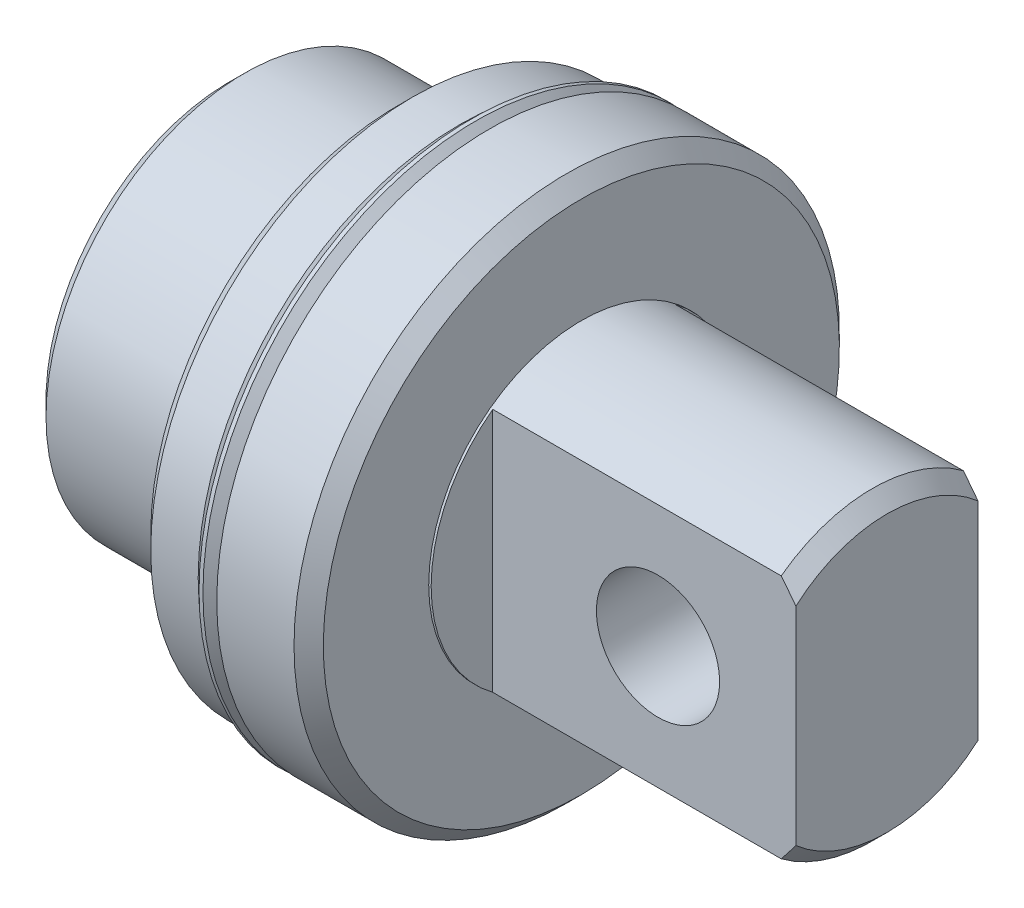
ISO-10303-21;
HEADER;
FILE_DESCRIPTION(('STEP AP214'),'2;1');
FILE_NAME('part.step','',(''),(''),'','','');
FILE_SCHEMA(('AUTOMOTIVE_DESIGN { 1 0 10303 214 1 1 1 1 }'));
ENDSEC;
DATA;
#1=APPLICATION_CONTEXT('core data for automotive mechanical design processes');
#2=APPLICATION_PROTOCOL_DEFINITION('international standard','automotive_design',2000,#1);
#3=PRODUCT_CONTEXT('',#1,'mechanical');
#4=PRODUCT('Part','Part','',(#3));
#5=PRODUCT_RELATED_PRODUCT_CATEGORY('part','',(#4));
#6=PRODUCT_DEFINITION_FORMATION('','',#4);
#7=PRODUCT_DEFINITION_CONTEXT('part definition',#1,'design');
#8=PRODUCT_DEFINITION('design','',#6,#7);
#9=PRODUCT_DEFINITION_SHAPE('','',#8);
#10=(LENGTH_UNIT() NAMED_UNIT(*) SI_UNIT(.MILLI.,.METRE.));
#11=(NAMED_UNIT(*) PLANE_ANGLE_UNIT() SI_UNIT($,.RADIAN.));
#12=(NAMED_UNIT(*) SI_UNIT($,.STERADIAN.) SOLID_ANGLE_UNIT());
#13=UNCERTAINTY_MEASURE_WITH_UNIT(LENGTH_MEASURE(1.E-05),#10,'distance_accuracy_value','');
#14=(GEOMETRIC_REPRESENTATION_CONTEXT(3) GLOBAL_UNCERTAINTY_ASSIGNED_CONTEXT((#13)) GLOBAL_UNIT_ASSIGNED_CONTEXT((#10,
#11,#12)) REPRESENTATION_CONTEXT('',''));
#15=CARTESIAN_POINT('',(0.,0.,0.));
#16=DIRECTION('',(0.,0.,1.));
#17=DIRECTION('',(1.,0.,0.));
#18=AXIS2_PLACEMENT_3D('',#15,#16,#17);
#19=CARTESIAN_POINT('',(25.4,7.16915,0.));
#20=DIRECTION('',(-1.,0.,0.));
#21=DIRECTION('',(0.,0.,1.));
#22=AXIS2_PLACEMENT_3D('',#19,#20,#21);
#23=PLANE('',#22);
#24=DIRECTION('',(0.,1.,0.));
#25=VECTOR('',#24,1.);
#26=CARTESIAN_POINT('',(25.4,-12.68984,-4.73075));
#27=LINE('',#26,#25);
#28=CARTESIAN_POINT('',(25.4,-5.38671664003222,-4.73075));
#29=VERTEX_POINT('',#28);
#30=CARTESIAN_POINT('',(25.4,5.38671664003222,-4.73075));
#31=VERTEX_POINT('',#30);
#32=EDGE_CURVE('E71',#29,#31,#27,.T.);
#33=ORIENTED_EDGE('',*,*,#32,.T.);
#34=CARTESIAN_POINT('',(25.4,0.,0.));
#35=DIRECTION('',(-1.,0.,0.));
#36=DIRECTION('',(0.,0.,1.));
#37=AXIS2_PLACEMENT_3D('',#34,#35,#36);
#38=CIRCLE('',#37,7.16915);
#39=CARTESIAN_POINT('',(25.4,5.38671664003222,4.73075));
#40=VERTEX_POINT('',#39);
#41=EDGE_CURVE('E20',#40,#31,#38,.T.);
#42=ORIENTED_EDGE('',*,*,#41,.F.);
#43=DIRECTION('',(0.,1.,0.));
#44=VECTOR('',#43,1.);
#45=CARTESIAN_POINT('',(25.4,12.68984,4.73075));
#46=LINE('',#45,#44);
#47=CARTESIAN_POINT('',(25.4,-5.38671664003222,4.73075));
#48=VERTEX_POINT('',#47);
#49=EDGE_CURVE('E69',#40,#48,#46,.F.);
#50=ORIENTED_EDGE('',*,*,#49,.T.);
#51=CARTESIAN_POINT('',(25.4,0.,0.));
#52=DIRECTION('',(-1.,0.,0.));
#53=DIRECTION('',(0.,0.,1.));
#54=AXIS2_PLACEMENT_3D('',#51,#52,#53);
#55=CIRCLE('',#54,7.16915);
#56=EDGE_CURVE('E81',#29,#48,#55,.T.);
#57=ORIENTED_EDGE('',*,*,#56,.F.);
#58=EDGE_LOOP('',(#33,#42,#50,#57));
#59=FACE_BOUND('',#58,.T.);
#60=ADVANCED_FACE('F17',(#59),#23,.F.);
#61=CARTESIAN_POINT('',(18.2372,0.,9.4615));
#62=DIRECTION('',(0.,0.,1.));
#63=DIRECTION('',(1.,0.,0.));
#64=AXIS2_PLACEMENT_3D('',#61,#62,#63);
#65=CYLINDRICAL_SURFACE('',#64,3.2004);
#66=CARTESIAN_POINT('',(18.2372,0.,4.73075));
#67=DIRECTION('',(0.,0.,1.));
#68=DIRECTION('',(1.,0.,0.));
#69=AXIS2_PLACEMENT_3D('',#66,#67,#68);
#70=CIRCLE('',#69,3.2004);
#71=CARTESIAN_POINT('',(21.4376,0.,4.73075));
#72=VERTEX_POINT('',#71);
#73=EDGE_CURVE('E95',#72,#72,#70,.T.);
#74=ORIENTED_EDGE('',*,*,#73,.T.);
#75=EDGE_LOOP('',(#74));
#76=FACE_BOUND('',#75,.T.);
#77=CARTESIAN_POINT('',(18.2372,0.,-4.73075));
#78=DIRECTION('',(0.,0.,1.));
#79=DIRECTION('',(1.,0.,0.));
#80=AXIS2_PLACEMENT_3D('',#77,#78,#79);
#81=CIRCLE('',#80,3.2004);
#82=CARTESIAN_POINT('',(21.4376,0.,-4.73075));
#83=VERTEX_POINT('',#82);
#84=EDGE_CURVE('E115',#83,#83,#81,.F.);
#85=ORIENTED_EDGE('',*,*,#84,.T.);
#86=EDGE_LOOP('',(#85));
#87=FACE_BOUND('',#86,.T.);
#88=ADVANCED_FACE('F189',(#76,#87),#65,.F.);
#89=CARTESIAN_POINT('',(24.638,0.,0.));
#90=DIRECTION('',(-1.,0.,0.));
#91=DIRECTION('',(0.,0.,1.));
#92=AXIS2_PLACEMENT_3D('',#89,#90,#91);
#93=CONICAL_SURFACE('',#92,7.93115,0.785398163397447);
#94=CARTESIAN_POINT('',(24.638,0.,0.));
#95=DIRECTION('',(-1.,0.,0.));
#96=DIRECTION('',(0.,0.,1.));
#97=AXIS2_PLACEMENT_3D('',#94,#95,#96);
#98=CIRCLE('',#97,7.93115);
#99=CARTESIAN_POINT('',(24.638,6.36577919503967,4.73075));
#100=VERTEX_POINT('',#99);
#101=CARTESIAN_POINT('',(24.638,6.36577919503967,-4.73075));
#102=VERTEX_POINT('',#101);
#103=EDGE_CURVE('E78',#100,#102,#98,.T.);
#104=ORIENTED_EDGE('',*,*,#103,.F.);
#105=CARTESIAN_POINT('',(24.638,6.36577919503967,4.73075));
#106=CARTESIAN_POINT('',(24.7027180398792,6.28514463726844,4.73075));
#107=CARTESIAN_POINT('',(24.7671723348312,6.20429775471651,4.73075));
#108=CARTESIAN_POINT('',(24.8954904508283,6.0421451960514,4.73075));
#109=CARTESIAN_POINT('',(24.9593543090734,5.96083954936932,4.73075));
#110=CARTESIAN_POINT('',(25.0864373903379,5.79772433204727,4.73075));
#111=CARTESIAN_POINT('',(25.1496566073011,5.71591475668462,4.73075));
#112=CARTESIAN_POINT('',(25.2753820502437,5.55174148093342,4.73075));
#113=CARTESIAN_POINT('',(25.3378882307153,5.46937774570445,4.73075));
#114=CARTESIAN_POINT('',(25.4000000000001,5.38671664003228,4.73075));
#115=B_SPLINE_CURVE_WITH_KNOTS('',3,(#105,#106,#107,#108,#109,#110,#111,#112,#113,#114),
.UNSPECIFIED.,.F.,.F.,(4,2,2,2,4),(0.,0.310182703228819,0.620345728552344,0.930511665064594,
1.24069728762528),.UNSPECIFIED.);
#116=EDGE_CURVE('E75',#100,#40,#115,.T.);
#117=ORIENTED_EDGE('',*,*,#116,.T.);
#118=ORIENTED_EDGE('',*,*,#41,.T.);
#119=CARTESIAN_POINT('',(25.4,5.38671664003222,-4.73075));
#120=CARTESIAN_POINT('',(25.3378882307153,5.46937774570442,-4.73075));
#121=CARTESIAN_POINT('',(25.2753820502437,5.55174148093341,-4.73075));
#122=CARTESIAN_POINT('',(25.1496566073011,5.71591475668462,-4.73075));
#123=CARTESIAN_POINT('',(25.0864373903379,5.79772433204727,-4.73075));
#124=CARTESIAN_POINT('',(24.9593543090734,5.96083954936932,-4.73075));
#125=CARTESIAN_POINT('',(24.8954904508283,6.04214519605139,-4.73075));
#126=CARTESIAN_POINT('',(24.7671723348312,6.20429775471651,-4.73075));
#127=CARTESIAN_POINT('',(24.7027180398792,6.28514463726845,-4.73075));
#128=CARTESIAN_POINT('',(24.638,6.3657791950397,-4.73075));
#129=B_SPLINE_CURVE_WITH_KNOTS('',3,(#119,#120,#121,#122,#123,#124,#125,#126,#127,#128),
.UNSPECIFIED.,.F.,.F.,(4,2,2,2,4),(0.,0.310185622560683,0.620351559072937,0.930514584396463,
1.24069728762528),.UNSPECIFIED.);
#130=EDGE_CURVE('E112',#31,#102,#129,.T.);
#131=ORIENTED_EDGE('',*,*,#130,.T.);
#132=EDGE_LOOP('',(#104,#117,#118,#131));
#133=FACE_BOUND('',#132,.T.);
#134=ADVANCED_FACE('F76',(#133),#93,.T.);
#135=CARTESIAN_POINT('',(9.652,0.,0.));
#136=DIRECTION('',(1.,0.,0.));
#137=DIRECTION('',(0.,0.,-1.));
#138=AXIS2_PLACEMENT_3D('',#135,#136,#137);
#139=PLANE('',#138);
#140=CARTESIAN_POINT('',(9.652,0.,0.));
#141=DIRECTION('',(-1.,0.,0.));
#142=DIRECTION('',(0.,0.,1.));
#143=AXIS2_PLACEMENT_3D('',#140,#141,#142);
#144=CIRCLE('',#143,7.93115);
#145=CARTESIAN_POINT('',(9.652,6.36577919503967,-4.73075));
#146=VERTEX_POINT('',#145);
#147=CARTESIAN_POINT('',(9.652,-6.36577919503967,-4.73075));
#148=VERTEX_POINT('',#147);
#149=EDGE_CURVE('E110',#146,#148,#144,.T.);
#150=ORIENTED_EDGE('',*,*,#149,.F.);
#151=DIRECTION('',(0.,1.,0.));
#152=VECTOR('',#151,1.);
#153=CARTESIAN_POINT('',(9.652,-12.68984,-4.73075));
#154=LINE('',#153,#152);
#155=EDGE_CURVE('E113',#146,#148,#154,.F.);
#156=ORIENTED_EDGE('',*,*,#155,.T.);
#157=EDGE_LOOP('',(#150,#156));
#158=FACE_BOUND('',#157,.T.);
#159=ADVANCED_FACE('F188',(#158),#139,.T.);
#160=CARTESIAN_POINT('',(25.527,-12.68984,-4.73075));
#161=DIRECTION('',(0.,0.,1.));
#162=DIRECTION('',(1.,0.,0.));
#163=AXIS2_PLACEMENT_3D('',#160,#161,#162);
#164=PLANE('',#163);
#165=ORIENTED_EDGE('',*,*,#84,.F.);
#166=EDGE_LOOP('',(#165));
#167=FACE_BOUND('',#166,.T.);
#168=DIRECTION('',(-1.,0.,0.));
#169=VECTOR('',#168,1.);
#170=CARTESIAN_POINT('',(25.4,6.36577919503967,-4.73075));
#171=LINE('',#170,#169);
#172=EDGE_CURVE('E94',#102,#146,#171,.T.);
#173=ORIENTED_EDGE('',*,*,#172,.F.);
#174=ORIENTED_EDGE('',*,*,#130,.F.);
#175=ORIENTED_EDGE('',*,*,#32,.F.);
#176=CARTESIAN_POINT('',(24.638,-6.36577919503967,-4.73075));
#177=CARTESIAN_POINT('',(24.7027180398792,-6.28514463726844,-4.73075));
#178=CARTESIAN_POINT('',(24.7671723348312,-6.20429775471651,-4.73075));
#179=CARTESIAN_POINT('',(24.8954904508283,-6.0421451960514,-4.73075));
#180=CARTESIAN_POINT('',(24.9593543090734,-5.96083954936932,-4.73075));
#181=CARTESIAN_POINT('',(25.0864373903379,-5.79772433204726,-4.73075));
#182=CARTESIAN_POINT('',(25.1496566073011,-5.71591475668462,-4.73075));
#183=CARTESIAN_POINT('',(25.2753820502437,-5.55174148093342,-4.73075));
#184=CARTESIAN_POINT('',(25.3378882307153,-5.46937774570445,-4.73075));
#185=CARTESIAN_POINT('',(25.4000000000001,-5.38671664003228,-4.73075));
#186=B_SPLINE_CURVE_WITH_KNOTS('',3,(#176,#177,#178,#179,#180,#181,#182,#183,#184,#185),
.UNSPECIFIED.,.F.,.F.,(4,2,2,2,4),(0.,0.310182703228819,0.620345728552347,0.930511665064596,
1.24069728762528),.UNSPECIFIED.);
#187=CARTESIAN_POINT('',(24.638,-6.36577919503967,-4.73075));
#188=VERTEX_POINT('',#187);
#189=EDGE_CURVE('E176',#188,#29,#186,.T.);
#190=ORIENTED_EDGE('',*,*,#189,.F.);
#191=DIRECTION('',(-1.,0.,0.));
#192=VECTOR('',#191,1.);
#193=CARTESIAN_POINT('',(25.4,-6.36577919503967,-4.73075000000001));
#194=LINE('',#193,#192);
#195=EDGE_CURVE('E107',#148,#188,#194,.F.);
#196=ORIENTED_EDGE('',*,*,#195,.F.);
#197=ORIENTED_EDGE('',*,*,#155,.F.);
#198=EDGE_LOOP('',(#173,#174,#175,#190,#196,#197));
#199=FACE_BOUND('',#198,.T.);
#200=ADVANCED_FACE('F170',(#167,#199),#164,.F.);
#201=CARTESIAN_POINT('',(24.638,0.,0.));
#202=DIRECTION('',(-1.,0.,0.));
#203=DIRECTION('',(0.,0.,1.));
#204=AXIS2_PLACEMENT_3D('',#201,#202,#203);
#205=CONICAL_SURFACE('',#204,7.93115,0.785398163397447);
#206=ORIENTED_EDGE('',*,*,#56,.T.);
#207=CARTESIAN_POINT('',(25.4,-5.38671664003222,4.73075));
#208=CARTESIAN_POINT('',(25.3378882307153,-5.46937774570442,4.73075));
#209=CARTESIAN_POINT('',(25.2753820502437,-5.55174148093341,4.73075));
#210=CARTESIAN_POINT('',(25.1496566073011,-5.71591475668462,4.73075));
#211=CARTESIAN_POINT('',(25.0864373903379,-5.79772433204727,4.73075));
#212=CARTESIAN_POINT('',(24.9593543090734,-5.96083954936932,4.73075));
#213=CARTESIAN_POINT('',(24.8954904508283,-6.04214519605139,4.73075));
#214=CARTESIAN_POINT('',(24.7671723348312,-6.20429775471651,4.73075));
#215=CARTESIAN_POINT('',(24.7027180398792,-6.28514463726845,4.73075));
#216=CARTESIAN_POINT('',(24.638,-6.3657791950397,4.73075));
#217=B_SPLINE_CURVE_WITH_KNOTS('',3,(#207,#208,#209,#210,#211,#212,#213,#214,#215,#216),
.UNSPECIFIED.,.F.,.F.,(4,2,2,2,4),(0.,0.310185622560682,0.620351559072937,0.930514584396463,
1.24069728762528),.UNSPECIFIED.);
#218=CARTESIAN_POINT('',(24.638,-6.36577919503967,4.73075));
#219=VERTEX_POINT('',#218);
#220=EDGE_CURVE('E86',#48,#219,#217,.T.);
#221=ORIENTED_EDGE('',*,*,#220,.T.);
#222=CARTESIAN_POINT('',(24.638,0.,0.));
#223=DIRECTION('',(-1.,0.,0.));
#224=DIRECTION('',(0.,0.,1.));
#225=AXIS2_PLACEMENT_3D('',#222,#223,#224);
#226=CIRCLE('',#225,7.93115);
#227=EDGE_CURVE('E104',#188,#219,#226,.T.);
#228=ORIENTED_EDGE('',*,*,#227,.F.);
#229=ORIENTED_EDGE('',*,*,#189,.T.);
#230=EDGE_LOOP('',(#206,#221,#228,#229));
#231=FACE_BOUND('',#230,.T.);
#232=ADVANCED_FACE('F165',(#231),#205,.T.);
#233=CARTESIAN_POINT('',(9.652,0.,0.));
#234=DIRECTION('',(1.,0.,0.));
#235=DIRECTION('',(0.,0.,-1.));
#236=AXIS2_PLACEMENT_3D('',#233,#234,#235);
#237=PLANE('',#236);
#238=CARTESIAN_POINT('',(9.652,0.,0.));
#239=DIRECTION('',(-1.,0.,0.));
#240=DIRECTION('',(0.,0.,1.));
#241=AXIS2_PLACEMENT_3D('',#238,#239,#240);
#242=CIRCLE('',#241,7.93115);
#243=CARTESIAN_POINT('',(9.652,-6.36577919503968,4.73075));
#244=VERTEX_POINT('',#243);
#245=CARTESIAN_POINT('',(9.652,6.36577919503967,4.73075));
#246=VERTEX_POINT('',#245);
#247=EDGE_CURVE('E99',#244,#246,#242,.T.);
#248=ORIENTED_EDGE('',*,*,#247,.F.);
#249=DIRECTION('',(0.,1.,0.));
#250=VECTOR('',#249,1.);
#251=CARTESIAN_POINT('',(9.652,12.68984,4.73075));
#252=LINE('',#251,#250);
#253=EDGE_CURVE('E34',#244,#246,#252,.T.);
#254=ORIENTED_EDGE('',*,*,#253,.T.);
#255=EDGE_LOOP('',(#248,#254));
#256=FACE_BOUND('',#255,.T.);
#257=ADVANCED_FACE('F169',(#256),#237,.T.);
#258=CARTESIAN_POINT('',(25.527,12.68984,4.73075));
#259=DIRECTION('',(0.,0.,-1.));
#260=DIRECTION('',(-1.,0.,0.));
#261=AXIS2_PLACEMENT_3D('',#258,#259,#260);
#262=PLANE('',#261);
#263=ORIENTED_EDGE('',*,*,#73,.F.);
#264=EDGE_LOOP('',(#263));
#265=FACE_BOUND('',#264,.T.);
#266=DIRECTION('',(-1.,0.,0.));
#267=VECTOR('',#266,1.);
#268=CARTESIAN_POINT('',(25.4,-6.36577919503967,4.73075));
#269=LINE('',#268,#267);
#270=EDGE_CURVE('E101',#219,#244,#269,.T.);
#271=ORIENTED_EDGE('',*,*,#270,.F.);
#272=ORIENTED_EDGE('',*,*,#220,.F.);
#273=ORIENTED_EDGE('',*,*,#49,.F.);
#274=ORIENTED_EDGE('',*,*,#116,.F.);
#275=DIRECTION('',(-1.,0.,0.));
#276=VECTOR('',#275,1.);
#277=CARTESIAN_POINT('',(25.4,6.36577919503967,4.73075));
#278=LINE('',#277,#276);
#279=EDGE_CURVE('E96',#246,#100,#278,.F.);
#280=ORIENTED_EDGE('',*,*,#279,.F.);
#281=ORIENTED_EDGE('',*,*,#253,.F.);
#282=EDGE_LOOP('',(#271,#272,#273,#274,#280,#281));
#283=FACE_BOUND('',#282,.T.);
#284=ADVANCED_FACE('F85',(#265,#283),#262,.F.);
#285=CARTESIAN_POINT('',(25.4,0.,0.));
#286=DIRECTION('',(-1.,0.,0.));
#287=DIRECTION('',(0.,0.,1.));
#288=AXIS2_PLACEMENT_3D('',#285,#286,#287);
#289=CYLINDRICAL_SURFACE('',#288,7.93115);
#290=CARTESIAN_POINT('',(9.525,0.,0.));
#291=DIRECTION('',(-1.,0.,0.));
#292=DIRECTION('',(0.,0.,1.));
#293=AXIS2_PLACEMENT_3D('',#290,#291,#292);
#294=CIRCLE('',#293,7.93115);
#295=CARTESIAN_POINT('',(9.525,0.,7.93115));
#296=VERTEX_POINT('',#295);
#297=EDGE_CURVE('E98',#296,#296,#294,.F.);
#298=ORIENTED_EDGE('',*,*,#297,.T.);
#299=EDGE_LOOP('',(#298));
#300=FACE_BOUND('',#299,.T.);
#301=ORIENTED_EDGE('',*,*,#247,.T.);
#302=ORIENTED_EDGE('',*,*,#279,.T.);
#303=ORIENTED_EDGE('',*,*,#103,.T.);
#304=ORIENTED_EDGE('',*,*,#172,.T.);
#305=ORIENTED_EDGE('',*,*,#149,.T.);
#306=ORIENTED_EDGE('',*,*,#195,.T.);
#307=ORIENTED_EDGE('',*,*,#227,.T.);
#308=ORIENTED_EDGE('',*,*,#270,.T.);
#309=EDGE_LOOP('',(#301,#302,#303,#304,#305,#306,#307,#308));
#310=FACE_BOUND('',#309,.T.);
#311=ADVANCED_FACE('F272',(#300,#310),#289,.T.);
#312=CARTESIAN_POINT('',(9.525,13.40485,0.));
#313=DIRECTION('',(-1.,0.,0.));
#314=DIRECTION('',(0.,0.,1.));
#315=AXIS2_PLACEMENT_3D('',#312,#313,#314);
#316=PLANE('',#315);
#317=CARTESIAN_POINT('',(9.525,0.,0.));
#318=DIRECTION('',(-1.,0.,0.));
#319=DIRECTION('',(0.,-1.,0.));
#320=AXIS2_PLACEMENT_3D('',#317,#318,#319);
#321=CIRCLE('',#320,13.40485);
#322=CARTESIAN_POINT('',(9.525,-13.40485,0.));
#323=VERTEX_POINT('',#322);
#324=EDGE_CURVE('E142',#323,#323,#321,.T.);
#325=ORIENTED_EDGE('',*,*,#324,.F.);
#326=EDGE_LOOP('',(#325));
#327=FACE_BOUND('',#326,.T.);
#328=ORIENTED_EDGE('',*,*,#297,.F.);
#329=EDGE_LOOP('',(#328));
#330=FACE_BOUND('',#329,.T.);
#331=ADVANCED_FACE('F266',(#327,#330),#316,.F.);
#332=CARTESIAN_POINT('',(8.763,0.,0.));
#333=DIRECTION('',(-1.,0.,0.));
#334=DIRECTION('',(0.,-1.,0.));
#335=AXIS2_PLACEMENT_3D('',#332,#333,#334);
#336=CONICAL_SURFACE('',#335,14.16685,0.785398163397448);
#337=CARTESIAN_POINT('',(8.763,0.,0.));
#338=DIRECTION('',(-1.,0.,0.));
#339=DIRECTION('',(0.,0.,1.));
#340=AXIS2_PLACEMENT_3D('',#337,#338,#339);
#341=CIRCLE('',#340,14.16685);
#342=CARTESIAN_POINT('',(8.763,0.,14.16685));
#343=VERTEX_POINT('',#342);
#344=EDGE_CURVE('E141',#343,#343,#341,.T.);
#345=ORIENTED_EDGE('',*,*,#344,.F.);
#346=EDGE_LOOP('',(#345));
#347=FACE_BOUND('',#346,.T.);
#348=ORIENTED_EDGE('',*,*,#324,.T.);
#349=EDGE_LOOP('',(#348));
#350=FACE_BOUND('',#349,.T.);
#351=ADVANCED_FACE('F263',(#347,#350),#336,.T.);
#352=CARTESIAN_POINT('',(9.525,0.,0.));
#353=DIRECTION('',(-1.,0.,0.));
#354=DIRECTION('',(0.,0.,1.));
#355=AXIS2_PLACEMENT_3D('',#352,#353,#354);
#356=CYLINDRICAL_SURFACE('',#355,14.16685);
#357=CARTESIAN_POINT('',(4.7498,0.,0.));
#358=DIRECTION('',(-1.,0.,0.));
#359=DIRECTION('',(0.,0.,1.));
#360=AXIS2_PLACEMENT_3D('',#357,#358,#359);
#361=CIRCLE('',#360,14.16685);
#362=CARTESIAN_POINT('',(4.7498,0.,14.16685));
#363=VERTEX_POINT('',#362);
#364=EDGE_CURVE('E138',#363,#363,#361,.F.);
#365=ORIENTED_EDGE('',*,*,#364,.T.);
#366=EDGE_LOOP('',(#365));
#367=FACE_BOUND('',#366,.T.);
#368=ORIENTED_EDGE('',*,*,#344,.T.);
#369=EDGE_LOOP('',(#368));
#370=FACE_BOUND('',#369,.T.);
#371=ADVANCED_FACE('F261',(#367,#370),#356,.T.);
#372=CARTESIAN_POINT('',(4.7498,12.84605,0.));
#373=DIRECTION('',(1.,0.,0.));
#374=DIRECTION('',(0.,0.,-1.));
#375=AXIS2_PLACEMENT_3D('',#372,#373,#374);
#376=PLANE('',#375);
#377=CARTESIAN_POINT('',(4.7498,0.,0.));
#378=DIRECTION('',(-1.,0.,0.));
#379=DIRECTION('',(0.,0.,1.));
#380=AXIS2_PLACEMENT_3D('',#377,#378,#379);
#381=CIRCLE('',#380,13.4490489304025);
#382=CARTESIAN_POINT('',(4.7498,0.,13.4490489304025));
#383=VERTEX_POINT('',#382);
#384=EDGE_CURVE('E135',#383,#383,#381,.T.);
#385=ORIENTED_EDGE('',*,*,#384,.F.);
#386=EDGE_LOOP('',(#385));
#387=FACE_BOUND('',#386,.T.);
#388=ORIENTED_EDGE('',*,*,#364,.F.);
#389=EDGE_LOOP('',(#388));
#390=FACE_BOUND('',#389,.T.);
#391=ADVANCED_FACE('F306',(#387,#390),#376,.F.);
#392=CARTESIAN_POINT('',(4.03199893040251,0.,0.));
#393=DIRECTION('',(-1.,0.,0.));
#394=DIRECTION('',(0.,0.,1.));
#395=AXIS2_PLACEMENT_3D('',#392,#393,#394);
#396=CONICAL_SURFACE('',#395,14.16685,0.785398163397456);
#397=ORIENTED_EDGE('',*,*,#384,.T.);
#398=EDGE_LOOP('',(#397));
#399=FACE_BOUND('',#398,.T.);
#400=CARTESIAN_POINT('',(4.03199893040252,0.,0.));
#401=DIRECTION('',(-1.,0.,0.));
#402=DIRECTION('',(0.,0.,1.));
#403=AXIS2_PLACEMENT_3D('',#400,#401,#402);
#404=CIRCLE('',#403,14.16685);
#405=CARTESIAN_POINT('',(4.03199893040252,0.,14.16685));
#406=VERTEX_POINT('',#405);
#407=EDGE_CURVE('E134',#406,#406,#404,.T.);
#408=ORIENTED_EDGE('',*,*,#407,.F.);
#409=EDGE_LOOP('',(#408));
#410=FACE_BOUND('',#409,.T.);
#411=ADVANCED_FACE('F314',(#399,#410),#396,.T.);
#412=CARTESIAN_POINT('',(4.7498,0.,0.));
#413=DIRECTION('',(-1.,0.,0.));
#414=DIRECTION('',(0.,0.,1.));
#415=AXIS2_PLACEMENT_3D('',#412,#413,#414);
#416=CYLINDRICAL_SURFACE('',#415,14.16685);
#417=ORIENTED_EDGE('',*,*,#407,.T.);
#418=EDGE_LOOP('',(#417));
#419=FACE_BOUND('',#418,.T.);
#420=CARTESIAN_POINT('',(3.82879893040252,0.,0.));
#421=DIRECTION('',(-1.,0.,0.));
#422=DIRECTION('',(0.,0.,1.));
#423=AXIS2_PLACEMENT_3D('',#420,#421,#422);
#424=CIRCLE('',#423,14.16685);
#425=CARTESIAN_POINT('',(3.82879893040252,0.,14.16685));
#426=VERTEX_POINT('',#425);
#427=EDGE_CURVE('E131',#426,#426,#424,.T.);
#428=ORIENTED_EDGE('',*,*,#427,.F.);
#429=EDGE_LOOP('',(#428));
#430=FACE_BOUND('',#429,.T.);
#431=ADVANCED_FACE('F322',(#419,#430),#416,.T.);
#432=CARTESIAN_POINT('',(3.82879893040252,14.16685,0.));
#433=DIRECTION('',(-1.,0.,0.));
#434=DIRECTION('',(0.,0.,1.));
#435=AXIS2_PLACEMENT_3D('',#432,#433,#434);
#436=PLANE('',#435);
#437=ORIENTED_EDGE('',*,*,#427,.T.);
#438=EDGE_LOOP('',(#437));
#439=FACE_BOUND('',#438,.T.);
#440=CARTESIAN_POINT('',(3.82879893040252,0.,0.));
#441=DIRECTION('',(-1.,0.,0.));
#442=DIRECTION('',(0.,-1.,0.));
#443=AXIS2_PLACEMENT_3D('',#440,#441,#442);
#444=CIRCLE('',#443,14.0826818041258);
#445=CARTESIAN_POINT('',(3.82879893040252,-14.0826818041258,0.));
#446=VERTEX_POINT('',#445);
#447=EDGE_CURVE('E127',#446,#446,#444,.F.);
#448=ORIENTED_EDGE('',*,*,#447,.T.);
#449=EDGE_LOOP('',(#448));
#450=FACE_BOUND('',#449,.T.);
#451=ADVANCED_FACE('F330',(#439,#450),#436,.T.);
#452=CARTESIAN_POINT('',(3.82879893040252,0.,0.));
#453=DIRECTION('',(-1.,0.,0.));
#454=DIRECTION('',(0.,-1.,0.));
#455=AXIS2_PLACEMENT_3D('',#452,#453,#454);
#456=CONICAL_SURFACE('',#455,14.0826818041258,0.785398163397448);
#457=ORIENTED_EDGE('',*,*,#447,.F.);
#458=EDGE_LOOP('',(#457));
#459=FACE_BOUND('',#458,.T.);
#460=CARTESIAN_POINT('',(4.62731280605345,0.,0.));
#461=DIRECTION('',(1.,0.,0.));
#462=DIRECTION('',(0.,0.,-1.));
#463=AXIS2_PLACEMENT_3D('',#460,#461,#462);
#464=CIRCLE('',#463,13.2841679284748);
#465=CARTESIAN_POINT('',(4.62731280605345,0.,-13.2841679284748));
#466=VERTEX_POINT('',#465);
#467=EDGE_CURVE('E130',#466,#466,#464,.T.);
#468=ORIENTED_EDGE('',*,*,#467,.T.);
#469=EDGE_LOOP('',(#468));
#470=FACE_BOUND('',#469,.T.);
#471=ADVANCED_FACE('F242',(#459,#470),#456,.F.);
#472=CARTESIAN_POINT('',(4.53751024484277,0.,0.));
#473=DIRECTION('',(1.,0.,0.));
#474=DIRECTION('',(0.,0.,-1.));
#475=AXIS2_PLACEMENT_3D('',#472,#473,#474);
#476=TOROIDAL_SURFACE('',#475,13.1943653672641,0.126999999999999);
#477=CARTESIAN_POINT('',(4.62731280605346,0.,0.));
#478=DIRECTION('',(1.,0.,0.));
#479=DIRECTION('',(0.,0.,-1.));
#480=AXIS2_PLACEMENT_3D('',#477,#478,#479);
#481=CIRCLE('',#480,13.1045628060535);
#482=CARTESIAN_POINT('',(4.62731280605346,0.,-13.1045628060535));
#483=VERTEX_POINT('',#482);
#484=EDGE_CURVE('E252',#483,#483,#481,.F.);
#485=ORIENTED_EDGE('',*,*,#484,.F.);
#486=EDGE_LOOP('',(#485));
#487=FACE_BOUND('',#486,.T.);
#488=ORIENTED_EDGE('',*,*,#467,.F.);
#489=EDGE_LOOP('',(#488));
#490=FACE_BOUND('',#489,.T.);
#491=ADVANCED_FACE('F237',(#487,#490),#476,.F.);
#492=CARTESIAN_POINT('',(4.62731280605346,0.,0.));
#493=DIRECTION('',(1.,0.,0.));
#494=DIRECTION('',(0.,0.,-1.));
#495=AXIS2_PLACEMENT_3D('',#492,#493,#494);
#496=CONICAL_SURFACE('',#495,13.1045628060535,0.785398163397452);
#497=ORIENTED_EDGE('',*,*,#484,.T.);
#498=EDGE_LOOP('',(#497));
#499=FACE_BOUND('',#498,.T.);
#500=CARTESIAN_POINT('',(4.3688,0.,0.));
#501=DIRECTION('',(-1.,0.,0.));
#502=DIRECTION('',(0.,0.,1.));
#503=AXIS2_PLACEMENT_3D('',#500,#501,#502);
#504=CIRCLE('',#503,12.84605);
#505=CARTESIAN_POINT('',(4.3688,0.,12.84605));
#506=VERTEX_POINT('',#505);
#507=EDGE_CURVE('E546',#506,#506,#504,.T.);
#508=ORIENTED_EDGE('',*,*,#507,.F.);
#509=EDGE_LOOP('',(#508));
#510=FACE_BOUND('',#509,.T.);
#511=ADVANCED_FACE('F233',(#499,#510),#496,.T.);
#512=CARTESIAN_POINT('',(9.525,0.,0.));
#513=DIRECTION('',(-1.,0.,0.));
#514=DIRECTION('',(0.,0.,1.));
#515=AXIS2_PLACEMENT_3D('',#512,#513,#514);
#516=CYLINDRICAL_SURFACE('',#515,12.84605);
#517=CARTESIAN_POINT('',(3.9878,0.,0.));
#518=DIRECTION('',(-1.,0.,0.));
#519=DIRECTION('',(0.,0.,1.));
#520=AXIS2_PLACEMENT_3D('',#517,#518,#519);
#521=CIRCLE('',#520,12.84605);
#522=CARTESIAN_POINT('',(3.9878,0.,12.84605));
#523=VERTEX_POINT('',#522);
#524=EDGE_CURVE('E549',#523,#523,#521,.T.);
#525=ORIENTED_EDGE('',*,*,#524,.F.);
#526=EDGE_LOOP('',(#525));
#527=FACE_BOUND('',#526,.T.);
#528=ORIENTED_EDGE('',*,*,#507,.T.);
#529=EDGE_LOOP('',(#528));
#530=FACE_BOUND('',#529,.T.);
#531=ADVANCED_FACE('F229',(#527,#530),#516,.T.);
#532=CARTESIAN_POINT('',(3.2258,0.,0.));
#533=DIRECTION('',(-1.,0.,0.));
#534=DIRECTION('',(0.,0.,1.));
#535=AXIS2_PLACEMENT_3D('',#532,#533,#534);
#536=CONICAL_SURFACE('',#535,13.60805,0.785398163397448);
#537=CARTESIAN_POINT('',(3.2258,0.,0.));
#538=DIRECTION('',(-1.,0.,0.));
#539=DIRECTION('',(0.,0.,1.));
#540=AXIS2_PLACEMENT_3D('',#537,#538,#539);
#541=CIRCLE('',#540,13.60805);
#542=CARTESIAN_POINT('',(3.2258,0.,13.60805));
#543=VERTEX_POINT('',#542);
#544=EDGE_CURVE('E558',#543,#543,#541,.T.);
#545=ORIENTED_EDGE('',*,*,#544,.F.);
#546=EDGE_LOOP('',(#545));
#547=FACE_BOUND('',#546,.T.);
#548=ORIENTED_EDGE('',*,*,#524,.T.);
#549=EDGE_LOOP('',(#548));
#550=FACE_BOUND('',#549,.T.);
#551=ADVANCED_FACE('F225',(#547,#550),#536,.T.);
#552=CARTESIAN_POINT('',(9.525,0.,0.));
#553=DIRECTION('',(-1.,0.,0.));
#554=DIRECTION('',(0.,0.,1.));
#555=AXIS2_PLACEMENT_3D('',#552,#553,#554);
#556=CYLINDRICAL_SURFACE('',#555,13.60805);
#557=CARTESIAN_POINT('',(0.762000000000001,0.,0.));
#558=DIRECTION('',(1.,0.,0.));
#559=DIRECTION('',(0.,0.,-1.));
#560=AXIS2_PLACEMENT_3D('',#557,#558,#559);
#561=CIRCLE('',#560,13.60805);
#562=CARTESIAN_POINT('',(0.762,0.,-13.60805));
#563=VERTEX_POINT('',#562);
#564=EDGE_CURVE('E126',#563,#563,#561,.F.);
#565=ORIENTED_EDGE('',*,*,#564,.F.);
#566=EDGE_LOOP('',(#565));
#567=FACE_BOUND('',#566,.T.);
#568=ORIENTED_EDGE('',*,*,#544,.T.);
#569=EDGE_LOOP('',(#568));
#570=FACE_BOUND('',#569,.T.);
#571=ADVANCED_FACE('F221',(#567,#570),#556,.T.);
#572=CARTESIAN_POINT('',(0.762,0.,0.));
#573=DIRECTION('',(1.,0.,0.));
#574=DIRECTION('',(0.,0.,-1.));
#575=AXIS2_PLACEMENT_3D('',#572,#573,#574);
#576=CONICAL_SURFACE('',#575,13.60805,0.785398163397448);
#577=CARTESIAN_POINT('',(0.,0.,0.));
#578=DIRECTION('',(1.,0.,0.));
#579=DIRECTION('',(0.,0.,-1.));
#580=AXIS2_PLACEMENT_3D('',#577,#578,#579);
#581=CIRCLE('',#580,12.84605);
#582=CARTESIAN_POINT('',(0.,0.,-12.84605));
#583=VERTEX_POINT('',#582);
#584=EDGE_CURVE('E123',#583,#583,#581,.T.);
#585=ORIENTED_EDGE('',*,*,#584,.T.);
#586=EDGE_LOOP('',(#585));
#587=FACE_BOUND('',#586,.T.);
#588=ORIENTED_EDGE('',*,*,#564,.T.);
#589=EDGE_LOOP('',(#588));
#590=FACE_BOUND('',#589,.T.);
#591=ADVANCED_FACE('F217',(#587,#590),#576,.T.);
#592=CARTESIAN_POINT('',(-8.7376,0.,0.));
#593=DIRECTION('',(1.,0.,0.));
#594=DIRECTION('',(0.,0.,-1.));
#595=AXIS2_PLACEMENT_3D('',#592,#593,#594);
#596=PLANE('',#595);
#597=CARTESIAN_POINT('',(-8.7376,0.,0.));
#598=DIRECTION('',(1.,0.,0.));
#599=DIRECTION('',(0.,0.,-1.));
#600=AXIS2_PLACEMENT_3D('',#597,#598,#599);
#601=CIRCLE('',#600,9.5504);
#602=CARTESIAN_POINT('',(-8.7376,0.,-9.5504));
#603=VERTEX_POINT('',#602);
#604=EDGE_CURVE('E120',#603,#603,#601,.T.);
#605=ORIENTED_EDGE('',*,*,#604,.F.);
#606=EDGE_LOOP('',(#605));
#607=FACE_BOUND('',#606,.T.);
#608=ADVANCED_FACE('F213',(#607),#596,.F.);
#609=CARTESIAN_POINT('',(0.,0.,0.));
#610=DIRECTION('',(1.,0.,0.));
#611=DIRECTION('',(0.,0.,-1.));
#612=AXIS2_PLACEMENT_3D('',#609,#610,#611);
#613=PLANE('',#612);
#614=CARTESIAN_POINT('',(0.,0.,0.));
#615=DIRECTION('',(-1.,0.,0.));
#616=DIRECTION('',(0.,0.,1.));
#617=AXIS2_PLACEMENT_3D('',#614,#615,#616);
#618=CIRCLE('',#617,10.3124);
#619=CARTESIAN_POINT('',(0.,0.,10.3124));
#620=VERTEX_POINT('',#619);
#621=EDGE_CURVE('E26',#620,#620,#618,.T.);
#622=ORIENTED_EDGE('',*,*,#621,.F.);
#623=EDGE_LOOP('',(#622));
#624=FACE_BOUND('',#623,.T.);
#625=ORIENTED_EDGE('',*,*,#584,.F.);
#626=EDGE_LOOP('',(#625));
#627=FACE_BOUND('',#626,.T.);
#628=ADVANCED_FACE('F206',(#624,#627),#613,.F.);
#629=CARTESIAN_POINT('',(-7.9756,0.,0.));
#630=DIRECTION('',(1.,0.,0.));
#631=DIRECTION('',(0.,0.,-1.));
#632=AXIS2_PLACEMENT_3D('',#629,#630,#631);
#633=CONICAL_SURFACE('',#632,10.3124,0.785398163397451);
#634=ORIENTED_EDGE('',*,*,#604,.T.);
#635=EDGE_LOOP('',(#634));
#636=FACE_BOUND('',#635,.T.);
#637=CARTESIAN_POINT('',(-7.9756,0.,0.));
#638=DIRECTION('',(-1.,0.,0.));
#639=DIRECTION('',(0.,0.,1.));
#640=AXIS2_PLACEMENT_3D('',#637,#638,#639);
#641=CIRCLE('',#640,10.3124);
#642=CARTESIAN_POINT('',(-7.9756,0.,10.3124));
#643=VERTEX_POINT('',#642);
#644=EDGE_CURVE('E11',#643,#643,#641,.F.);
#645=ORIENTED_EDGE('',*,*,#644,.F.);
#646=EDGE_LOOP('',(#645));
#647=FACE_BOUND('',#646,.T.);
#648=ADVANCED_FACE('F200',(#636,#647),#633,.T.);
#649=CARTESIAN_POINT('',(0.,0.,0.));
#650=DIRECTION('',(-1.,0.,0.));
#651=DIRECTION('',(0.,0.,1.));
#652=AXIS2_PLACEMENT_3D('',#649,#650,#651);
#653=CYLINDRICAL_SURFACE('',#652,10.3124);
#654=ORIENTED_EDGE('',*,*,#644,.T.);
#655=EDGE_LOOP('',(#654));
#656=FACE_BOUND('',#655,.T.);
#657=ORIENTED_EDGE('',*,*,#621,.T.);
#658=EDGE_LOOP('',(#657));
#659=FACE_BOUND('',#658,.T.);
#660=ADVANCED_FACE('F198',(#656,#659),#653,.T.);
#661=CLOSED_SHELL('',(#60,#88,#134,#159,#200,#232,#257,#284,#311,#331,#351,#371,#391,#411,#431,
#451,#471,#491,#511,#531,#551,#571,#591,#608,#628,#648,#660));
#662=MANIFOLD_SOLID_BREP('B1',#661);
#663=ADVANCED_BREP_SHAPE_REPRESENTATION('',(#18,#662),#14);
#664=SHAPE_DEFINITION_REPRESENTATION(#9,#663);
ENDSEC;
END-ISO-10303-21;
